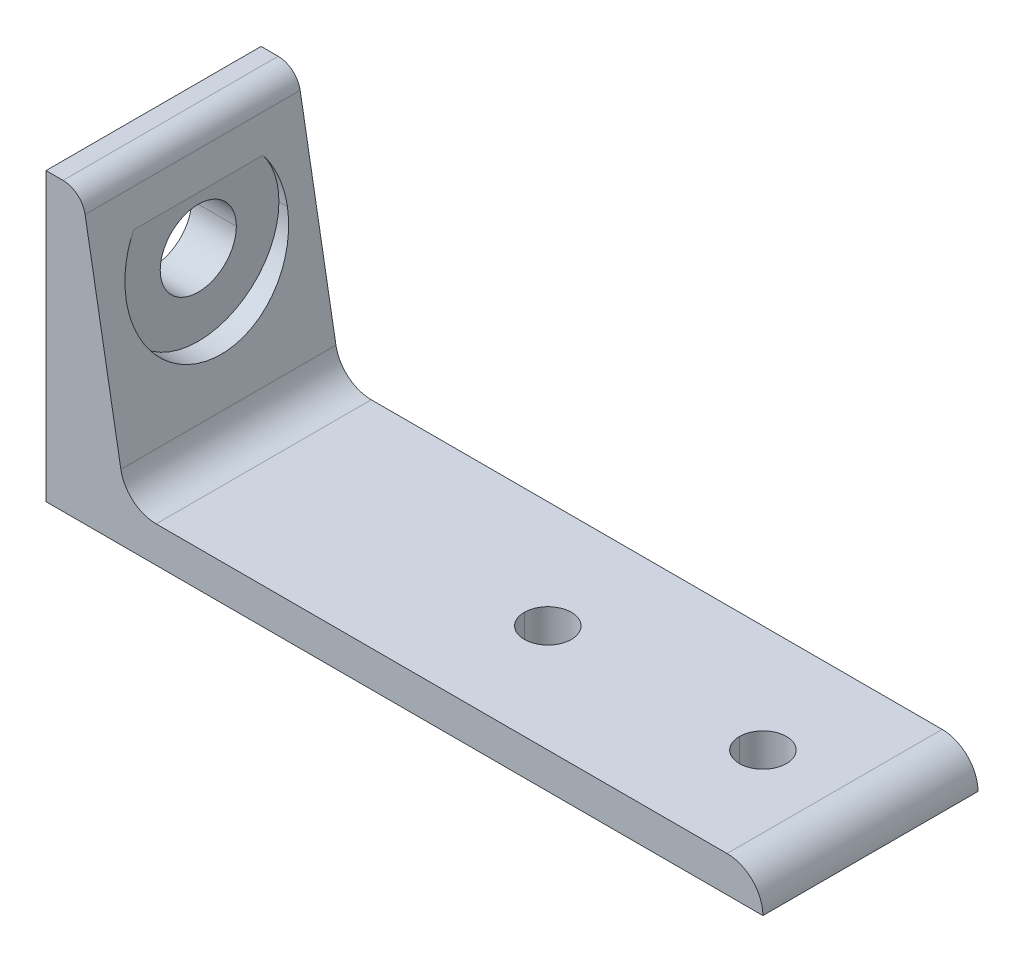
ISO-10303-21;
HEADER;
FILE_DESCRIPTION(('STEP AP214'),'2;1');
FILE_NAME('part.step','',(''),(''),'','','');
FILE_SCHEMA(('AUTOMOTIVE_DESIGN { 1 0 10303 214 1 1 1 1 }'));
ENDSEC;
DATA;
#1=APPLICATION_CONTEXT('core data for automotive mechanical design processes');
#2=APPLICATION_PROTOCOL_DEFINITION('international standard','automotive_design',2000,#1);
#3=PRODUCT_CONTEXT('',#1,'mechanical');
#4=PRODUCT('Part','Part','',(#3));
#5=PRODUCT_RELATED_PRODUCT_CATEGORY('part','',(#4));
#6=PRODUCT_DEFINITION_FORMATION('','',#4);
#7=PRODUCT_DEFINITION_CONTEXT('part definition',#1,'design');
#8=PRODUCT_DEFINITION('design','',#6,#7);
#9=PRODUCT_DEFINITION_SHAPE('','',#8);
#10=(LENGTH_UNIT() NAMED_UNIT(*) SI_UNIT(.MILLI.,.METRE.));
#11=(NAMED_UNIT(*) PLANE_ANGLE_UNIT() SI_UNIT($,.RADIAN.));
#12=(NAMED_UNIT(*) SI_UNIT($,.STERADIAN.) SOLID_ANGLE_UNIT());
#13=UNCERTAINTY_MEASURE_WITH_UNIT(LENGTH_MEASURE(1.E-05),#10,'distance_accuracy_value','');
#14=(GEOMETRIC_REPRESENTATION_CONTEXT(3) GLOBAL_UNCERTAINTY_ASSIGNED_CONTEXT((#13)) GLOBAL_UNIT_ASSIGNED_CONTEXT((#10,
#11,#12)) REPRESENTATION_CONTEXT('',''));
#15=CARTESIAN_POINT('',(0.,0.,0.));
#16=DIRECTION('',(0.,0.,1.));
#17=DIRECTION('',(1.,0.,0.));
#18=AXIS2_PLACEMENT_3D('',#15,#16,#17);
#19=CARTESIAN_POINT('',(107.95,-30.48,0.));
#20=DIRECTION('',(0.,1.,0.));
#21=DIRECTION('',(-1.,0.,0.));
#22=AXIS2_PLACEMENT_3D('',#19,#20,#21);
#23=CYLINDRICAL_SURFACE('',#22,4.1656);
#24=DIRECTION('',(0.,1.,0.));
#25=VECTOR('',#24,1.);
#26=CARTESIAN_POINT('',(112.1156,-30.48,0.));
#27=LINE('',#26,#25);
#28=CARTESIAN_POINT('',(112.1156,0.,0.));
#29=VERTEX_POINT('',#28);
#30=CARTESIAN_POINT('',(112.1156,6.35,0.));
#31=VERTEX_POINT('',#30);
#32=EDGE_CURVE('E381',#29,#31,#27,.T.);
#33=ORIENTED_EDGE('',*,*,#32,.F.);
#34=CARTESIAN_POINT('',(107.95,0.,0.));
#35=DIRECTION('',(0.,1.,0.));
#36=DIRECTION('',(-1.,0.,0.));
#37=AXIS2_PLACEMENT_3D('',#34,#35,#36);
#38=CIRCLE('',#37,4.1656);
#39=CARTESIAN_POINT('',(103.7844,0.,0.));
#40=VERTEX_POINT('',#39);
#41=EDGE_CURVE('E277',#40,#29,#38,.T.);
#42=ORIENTED_EDGE('',*,*,#41,.F.);
#43=DIRECTION('',(0.,1.,0.));
#44=VECTOR('',#43,1.);
#45=CARTESIAN_POINT('',(103.7844,-30.48,0.));
#46=LINE('',#45,#44);
#47=CARTESIAN_POINT('',(103.7844,6.35,0.));
#48=VERTEX_POINT('',#47);
#49=EDGE_CURVE('E216',#40,#48,#46,.T.);
#50=ORIENTED_EDGE('',*,*,#49,.T.);
#51=CARTESIAN_POINT('',(107.95,6.35,0.));
#52=DIRECTION('',(0.,1.,0.));
#53=DIRECTION('',(-1.,0.,0.));
#54=AXIS2_PLACEMENT_3D('',#51,#52,#53);
#55=CIRCLE('',#54,4.1656);
#56=EDGE_CURVE('E313',#48,#31,#55,.T.);
#57=ORIENTED_EDGE('',*,*,#56,.T.);
#58=EDGE_LOOP('',(#33,#42,#50,#57));
#59=FACE_BOUND('',#58,.T.);
#60=ADVANCED_FACE('F18',(#59),#23,.F.);
#61=CARTESIAN_POINT('',(69.85,-30.48,0.));
#62=DIRECTION('',(0.,1.,0.));
#63=DIRECTION('',(-1.,0.,0.));
#64=AXIS2_PLACEMENT_3D('',#61,#62,#63);
#65=CYLINDRICAL_SURFACE('',#64,4.1656);
#66=DIRECTION('',(0.,1.,0.));
#67=VECTOR('',#66,1.);
#68=CARTESIAN_POINT('',(74.0156,-30.48,0.));
#69=LINE('',#68,#67);
#70=CARTESIAN_POINT('',(74.0156,0.,0.));
#71=VERTEX_POINT('',#70);
#72=CARTESIAN_POINT('',(74.0156,6.35,0.));
#73=VERTEX_POINT('',#72);
#74=EDGE_CURVE('E218',#71,#73,#69,.T.);
#75=ORIENTED_EDGE('',*,*,#74,.F.);
#76=CARTESIAN_POINT('',(69.85,0.,0.));
#77=DIRECTION('',(0.,1.,0.));
#78=DIRECTION('',(-1.,0.,0.));
#79=AXIS2_PLACEMENT_3D('',#76,#77,#78);
#80=CIRCLE('',#79,4.1656);
#81=CARTESIAN_POINT('',(65.6844,0.,0.));
#82=VERTEX_POINT('',#81);
#83=EDGE_CURVE('E286',#82,#71,#80,.T.);
#84=ORIENTED_EDGE('',*,*,#83,.F.);
#85=DIRECTION('',(0.,1.,0.));
#86=VECTOR('',#85,1.);
#87=CARTESIAN_POINT('',(65.6844,-30.48,0.));
#88=LINE('',#87,#86);
#89=CARTESIAN_POINT('',(65.6844,6.35,0.));
#90=VERTEX_POINT('',#89);
#91=EDGE_CURVE('E244',#82,#90,#88,.T.);
#92=ORIENTED_EDGE('',*,*,#91,.T.);
#93=CARTESIAN_POINT('',(69.85,6.35,0.));
#94=DIRECTION('',(0.,1.,0.));
#95=DIRECTION('',(-1.,0.,0.));
#96=AXIS2_PLACEMENT_3D('',#93,#94,#95);
#97=CIRCLE('',#96,4.1656);
#98=EDGE_CURVE('E316',#90,#73,#97,.T.);
#99=ORIENTED_EDGE('',*,*,#98,.T.);
#100=EDGE_LOOP('',(#75,#84,#92,#99));
#101=FACE_BOUND('',#100,.T.);
#102=ADVANCED_FACE('F851',(#101),#65,.F.);
#103=CARTESIAN_POINT('',(7.9248,33.3248,0.));
#104=DIRECTION('',(-1.,0.,0.));
#105=DIRECTION('',(0.,0.,1.));
#106=AXIS2_PLACEMENT_3D('',#103,#104,#105);
#107=PLANE('',#106);
#108=CARTESIAN_POINT('',(7.9248,33.3248,0.));
#109=DIRECTION('',(1.,0.,0.));
#110=DIRECTION('',(0.,0.,1.));
#111=AXIS2_PLACEMENT_3D('',#108,#109,#110);
#112=CIRCLE('',#111,6.7437);
#113=CARTESIAN_POINT('',(7.9248,33.3248,6.7437));
#114=VERTEX_POINT('',#113);
#115=CARTESIAN_POINT('',(7.9248,33.3248,-6.7437));
#116=VERTEX_POINT('',#115);
#117=EDGE_CURVE('E198',#114,#116,#112,.T.);
#118=ORIENTED_EDGE('',*,*,#117,.F.);
#119=CARTESIAN_POINT('',(7.9248,33.3248,0.));
#120=DIRECTION('',(1.,0.,0.));
#121=DIRECTION('',(0.,0.,1.));
#122=AXIS2_PLACEMENT_3D('',#119,#120,#121);
#123=CIRCLE('',#122,6.7437);
#124=EDGE_CURVE('E26',#116,#114,#123,.T.);
#125=ORIENTED_EDGE('',*,*,#124,.F.);
#126=EDGE_LOOP('',(#118,#125));
#127=FACE_BOUND('',#126,.T.);
#128=CARTESIAN_POINT('',(7.9248,33.3248,0.));
#129=DIRECTION('',(-1.,0.,0.));
#130=DIRECTION('',(0.,0.,1.));
#131=AXIS2_PLACEMENT_3D('',#128,#129,#130);
#132=CIRCLE('',#131,14.2875);
#133=CARTESIAN_POINT('',(7.9248,41.8688653904658,-11.4512707964419));
#134=VERTEX_POINT('',#133);
#135=CARTESIAN_POINT('',(7.9248,33.3248,-14.2875));
#136=VERTEX_POINT('',#135);
#137=EDGE_CURVE('E11',#134,#136,#132,.T.);
#138=ORIENTED_EDGE('',*,*,#137,.F.);
#139=DIRECTION('',(0.,0.,-1.));
#140=VECTOR('',#139,1.);
#141=CARTESIAN_POINT('',(7.9248,41.8688653904658,19.05));
#142=LINE('',#141,#140);
#143=CARTESIAN_POINT('',(7.9248,41.8688653904658,11.4512707964419));
#144=VERTEX_POINT('',#143);
#145=EDGE_CURVE('E178',#144,#134,#142,.T.);
#146=ORIENTED_EDGE('',*,*,#145,.F.);
#147=CARTESIAN_POINT('',(7.9248,33.3248,0.));
#148=DIRECTION('',(-1.,0.,0.));
#149=DIRECTION('',(0.,0.,1.));
#150=AXIS2_PLACEMENT_3D('',#147,#148,#149);
#151=CIRCLE('',#150,14.2875);
#152=CARTESIAN_POINT('',(7.9248,33.3248,14.2875));
#153=VERTEX_POINT('',#152);
#154=EDGE_CURVE('E182',#153,#144,#151,.T.);
#155=ORIENTED_EDGE('',*,*,#154,.F.);
#156=CARTESIAN_POINT('',(7.9248,33.3248,0.));
#157=DIRECTION('',(-1.,0.,0.));
#158=DIRECTION('',(0.,0.,1.));
#159=AXIS2_PLACEMENT_3D('',#156,#157,#158);
#160=CIRCLE('',#159,14.2875);
#161=EDGE_CURVE('E210',#136,#153,#160,.T.);
#162=ORIENTED_EDGE('',*,*,#161,.F.);
#163=EDGE_LOOP('',(#138,#146,#155,#162));
#164=FACE_BOUND('',#163,.T.);
#165=ADVANCED_FACE('F180',(#127,#164),#107,.F.);
#166=CARTESIAN_POINT('',(44.7548,33.3248,0.));
#167=DIRECTION('',(-1.,0.,0.));
#168=DIRECTION('',(0.,0.,1.));
#169=AXIS2_PLACEMENT_3D('',#166,#167,#168);
#170=CYLINDRICAL_SURFACE('',#169,14.2875);
#171=DIRECTION('',(-1.,0.,0.));
#172=VECTOR('',#171,1.);
#173=CARTESIAN_POINT('',(44.7548,33.3248,-14.2875));
#174=LINE('',#173,#172);
#175=CARTESIAN_POINT('',(9.43134925327651,33.3248,-14.2875));
#176=VERTEX_POINT('',#175);
#177=EDGE_CURVE('E250',#176,#136,#174,.T.);
#178=ORIENTED_EDGE('',*,*,#177,.F.);
#179=CARTESIAN_POINT('',(7.9248,41.8688653904658,-11.4512707964419));
#180=CARTESIAN_POINT('',(8.36379439188637,39.3792044768465,-13.3088659947548));
#181=CARTESIAN_POINT('',(8.88362555644232,36.4310954440296,-14.2875));
#182=CARTESIAN_POINT('',(9.43134925327651,33.3248,-14.2875));
#183=(BOUNDED_CURVE() B_SPLINE_CURVE(3,(#179,#180,#181,#182),.UNSPECIFIED.,.F.,
.F.) B_SPLINE_CURVE_WITH_KNOTS((4,4),(0.929780621469788,1.5707963267949),
.UNSPECIFIED.) CURVE() GEOMETRIC_REPRESENTATION_ITEM() RATIONAL_B_SPLINE_CURVE((1.,
0.966050361475496,0.966050361475496,1.)) REPRESENTATION_ITEM(''));
#184=EDGE_CURVE('E188',#134,#176,#183,.T.);
#185=ORIENTED_EDGE('',*,*,#184,.F.);
#186=ORIENTED_EDGE('',*,*,#137,.T.);
#187=EDGE_LOOP('',(#178,#185,#186));
#188=FACE_BOUND('',#187,.T.);
#189=ADVANCED_FACE('F831',(#188),#170,.F.);
#190=CARTESIAN_POINT('',(36.83,33.3248,0.));
#191=DIRECTION('',(-1.,0.,0.));
#192=DIRECTION('',(0.,0.,1.));
#193=AXIS2_PLACEMENT_3D('',#190,#191,#192);
#194=CYLINDRICAL_SURFACE('',#193,6.7437);
#195=DIRECTION('',(-1.,0.,0.));
#196=VECTOR('',#195,1.);
#197=CARTESIAN_POINT('',(36.83,33.3248,-6.7437));
#198=LINE('',#197,#196);
#199=CARTESIAN_POINT('',(0.,33.3248,-6.7437));
#200=VERTEX_POINT('',#199);
#201=EDGE_CURVE('E236',#116,#200,#198,.T.);
#202=ORIENTED_EDGE('',*,*,#201,.F.);
#203=ORIENTED_EDGE('',*,*,#124,.T.);
#204=DIRECTION('',(-1.,0.,0.));
#205=VECTOR('',#204,1.);
#206=CARTESIAN_POINT('',(36.83,33.3248,6.7437));
#207=LINE('',#206,#205);
#208=CARTESIAN_POINT('',(0.,33.3248,6.7437));
#209=VERTEX_POINT('',#208);
#210=EDGE_CURVE('E260',#114,#209,#207,.T.);
#211=ORIENTED_EDGE('',*,*,#210,.T.);
#212=CARTESIAN_POINT('',(0.,33.3248,0.));
#213=DIRECTION('',(-1.,0.,0.));
#214=DIRECTION('',(0.,0.,1.));
#215=AXIS2_PLACEMENT_3D('',#212,#213,#214);
#216=CIRCLE('',#215,6.7437);
#217=EDGE_CURVE('E357',#209,#200,#216,.T.);
#218=ORIENTED_EDGE('',*,*,#217,.T.);
#219=EDGE_LOOP('',(#202,#203,#211,#218));
#220=FACE_BOUND('',#219,.T.);
#221=ADVANCED_FACE('F364',(#220),#194,.F.);
#222=CARTESIAN_POINT('',(3.02515162142313,46.8376,-19.05));
#223=DIRECTION('',(0.,0.,-1.));
#224=DIRECTION('',(0.,-1.,0.));
#225=AXIS2_PLACEMENT_3D('',#222,#223,#224);
#226=PLANE('',#225);
#227=DIRECTION('',(1.,0.,0.));
#228=VECTOR('',#227,1.);
#229=CARTESIAN_POINT('',(127.,0.,-19.05));
#230=LINE('',#229,#228);
#231=CARTESIAN_POINT('',(0.,0.,-19.05));
#232=VERTEX_POINT('',#231);
#233=CARTESIAN_POINT('',(127.,0.,-19.05));
#234=VERTEX_POINT('',#233);
#235=EDGE_CURVE('E264',#232,#234,#230,.T.);
#236=ORIENTED_EDGE('',*,*,#235,.F.);
#237=DIRECTION('',(0.,-1.,0.));
#238=VECTOR('',#237,1.);
#239=CARTESIAN_POINT('',(0.,0.,-19.05));
#240=LINE('',#239,#238);
#241=CARTESIAN_POINT('',(0.,50.8,-19.05));
#242=VERTEX_POINT('',#241);
#243=EDGE_CURVE('E50',#242,#232,#240,.T.);
#244=ORIENTED_EDGE('',*,*,#243,.F.);
#245=DIRECTION('',(-1.,0.,0.));
#246=VECTOR('',#245,1.);
#247=CARTESIAN_POINT('',(3.02515162142313,50.8,-19.05));
#248=LINE('',#247,#246);
#249=CARTESIAN_POINT('',(3.02515162142313,50.8,-19.05));
#250=VERTEX_POINT('',#249);
#251=EDGE_CURVE('E349',#250,#242,#248,.T.);
#252=ORIENTED_EDGE('',*,*,#251,.F.);
#253=CARTESIAN_POINT('',(3.02515162142313,46.8376,-19.05));
#254=DIRECTION('',(0.,0.,1.));
#255=DIRECTION('',(-1.,0.,0.));
#256=AXIS2_PLACEMENT_3D('',#253,#254,#255);
#257=CIRCLE('',#256,3.9624);
#258=CARTESIAN_POINT('',(6.92735386195871,47.5256635391874,-19.05));
#259=VERTEX_POINT('',#258);
#260=EDGE_CURVE('E309',#259,#250,#257,.T.);
#261=ORIENTED_EDGE('',*,*,#260,.F.);
#262=DIRECTION('',(-0.173648177666927,0.984807753012209,0.));
#263=VECTOR('',#262,1.);
#264=CARTESIAN_POINT('',(6.92735386195871,47.5256635391874,-19.05));
#265=LINE('',#264,#263);
#266=CARTESIAN_POINT('',(13.2624877188393,11.597334071815,-19.05));
#267=VERTEX_POINT('',#266);
#268=EDGE_CURVE('E251',#267,#259,#265,.T.);
#269=ORIENTED_EDGE('',*,*,#268,.F.);
#270=CARTESIAN_POINT('',(19.5160169504668,12.7,-19.05));
#271=DIRECTION('',(0.,0.,-1.));
#272=DIRECTION('',(1.,0.,0.));
#273=AXIS2_PLACEMENT_3D('',#270,#271,#272);
#274=CIRCLE('',#273,6.35);
#275=CARTESIAN_POINT('',(19.5160169504669,6.35,-19.05));
#276=VERTEX_POINT('',#275);
#277=EDGE_CURVE('E319',#276,#267,#274,.T.);
#278=ORIENTED_EDGE('',*,*,#277,.F.);
#279=DIRECTION('',(-1.,0.,0.));
#280=VECTOR('',#279,1.);
#281=CARTESIAN_POINT('',(19.5160169504669,6.35,-19.05));
#282=LINE('',#281,#280);
#283=CARTESIAN_POINT('',(120.65,6.35,-19.05));
#284=VERTEX_POINT('',#283);
#285=EDGE_CURVE('E235',#284,#276,#282,.T.);
#286=ORIENTED_EDGE('',*,*,#285,.F.);
#287=CARTESIAN_POINT('',(120.65,0.,-19.05));
#288=DIRECTION('',(0.,0.,1.));
#289=DIRECTION('',(-1.,0.,0.));
#290=AXIS2_PLACEMENT_3D('',#287,#288,#289);
#291=CIRCLE('',#290,6.35);
#292=EDGE_CURVE('E289',#234,#284,#291,.T.);
#293=ORIENTED_EDGE('',*,*,#292,.F.);
#294=EDGE_LOOP('',(#236,#244,#252,#261,#269,#278,#286,#293));
#295=FACE_BOUND('',#294,.T.);
#296=ADVANCED_FACE('F791',(#295),#226,.T.);
#297=CARTESIAN_POINT('',(3.02515162142313,46.8376,19.05));
#298=DIRECTION('',(0.,0.,-1.));
#299=DIRECTION('',(0.,-1.,0.));
#300=AXIS2_PLACEMENT_3D('',#297,#298,#299);
#301=PLANE('',#300);
#302=DIRECTION('',(1.,0.,0.));
#303=VECTOR('',#302,1.);
#304=CARTESIAN_POINT('',(127.,0.,19.05));
#305=LINE('',#304,#303);
#306=CARTESIAN_POINT('',(0.,0.,19.05));
#307=VERTEX_POINT('',#306);
#308=CARTESIAN_POINT('',(127.,0.,19.05));
#309=VERTEX_POINT('',#308);
#310=EDGE_CURVE('E269',#307,#309,#305,.T.);
#311=ORIENTED_EDGE('',*,*,#310,.T.);
#312=CARTESIAN_POINT('',(120.65,0.,19.05));
#313=DIRECTION('',(0.,0.,1.));
#314=DIRECTION('',(-1.,0.,0.));
#315=AXIS2_PLACEMENT_3D('',#312,#313,#314);
#316=CIRCLE('',#315,6.35);
#317=CARTESIAN_POINT('',(120.65,6.35,19.05));
#318=VERTEX_POINT('',#317);
#319=EDGE_CURVE('E297',#309,#318,#316,.T.);
#320=ORIENTED_EDGE('',*,*,#319,.T.);
#321=DIRECTION('',(-1.,0.,0.));
#322=VECTOR('',#321,1.);
#323=CARTESIAN_POINT('',(19.5160169504669,6.35,19.05));
#324=LINE('',#323,#322);
#325=CARTESIAN_POINT('',(19.5160169504669,6.35,19.05));
#326=VERTEX_POINT('',#325);
#327=EDGE_CURVE('E234',#318,#326,#324,.T.);
#328=ORIENTED_EDGE('',*,*,#327,.T.);
#329=CARTESIAN_POINT('',(19.5160169504668,12.7,19.05));
#330=DIRECTION('',(0.,0.,-1.));
#331=DIRECTION('',(1.,0.,0.));
#332=AXIS2_PLACEMENT_3D('',#329,#330,#331);
#333=CIRCLE('',#332,6.35);
#334=CARTESIAN_POINT('',(13.2624877188393,11.597334071815,19.05));
#335=VERTEX_POINT('',#334);
#336=EDGE_CURVE('E255',#326,#335,#333,.T.);
#337=ORIENTED_EDGE('',*,*,#336,.T.);
#338=DIRECTION('',(-0.173648177666927,0.984807753012209,0.));
#339=VECTOR('',#338,1.);
#340=CARTESIAN_POINT('',(6.92735386195871,47.5256635391874,19.05));
#341=LINE('',#340,#339);
#342=CARTESIAN_POINT('',(6.92735386195871,47.5256635391874,19.05));
#343=VERTEX_POINT('',#342);
#344=EDGE_CURVE('E189',#335,#343,#341,.T.);
#345=ORIENTED_EDGE('',*,*,#344,.T.);
#346=CARTESIAN_POINT('',(3.02515162142313,46.8376,19.05));
#347=DIRECTION('',(0.,0.,1.));
#348=DIRECTION('',(-1.,0.,0.));
#349=AXIS2_PLACEMENT_3D('',#346,#347,#348);
#350=CIRCLE('',#349,3.9624);
#351=CARTESIAN_POINT('',(3.02515162142313,50.8,19.05));
#352=VERTEX_POINT('',#351);
#353=EDGE_CURVE('E308',#343,#352,#350,.T.);
#354=ORIENTED_EDGE('',*,*,#353,.T.);
#355=DIRECTION('',(-1.,0.,0.));
#356=VECTOR('',#355,1.);
#357=CARTESIAN_POINT('',(3.02515162142313,50.8,19.05));
#358=LINE('',#357,#356);
#359=CARTESIAN_POINT('',(0.,50.8,19.05));
#360=VERTEX_POINT('',#359);
#361=EDGE_CURVE('E280',#352,#360,#358,.T.);
#362=ORIENTED_EDGE('',*,*,#361,.T.);
#363=DIRECTION('',(0.,-1.,0.));
#364=VECTOR('',#363,1.);
#365=CARTESIAN_POINT('',(0.,0.,19.05));
#366=LINE('',#365,#364);
#367=EDGE_CURVE('E39',#360,#307,#366,.T.);
#368=ORIENTED_EDGE('',*,*,#367,.T.);
#369=EDGE_LOOP('',(#311,#320,#328,#337,#345,#354,#362,#368));
#370=FACE_BOUND('',#369,.T.);
#371=ADVANCED_FACE('F786',(#370),#301,.F.);
#372=CARTESIAN_POINT('',(0.,0.,19.05));
#373=DIRECTION('',(1.,0.,0.));
#374=DIRECTION('',(0.,1.,0.));
#375=AXIS2_PLACEMENT_3D('',#372,#373,#374);
#376=PLANE('',#375);
#377=ORIENTED_EDGE('',*,*,#217,.F.);
#378=CARTESIAN_POINT('',(0.,33.3248,0.));
#379=DIRECTION('',(-1.,0.,0.));
#380=DIRECTION('',(0.,0.,1.));
#381=AXIS2_PLACEMENT_3D('',#378,#379,#380);
#382=CIRCLE('',#381,6.7437);
#383=EDGE_CURVE('E240',#200,#209,#382,.T.);
#384=ORIENTED_EDGE('',*,*,#383,.F.);
#385=EDGE_LOOP('',(#377,#384));
#386=FACE_BOUND('',#385,.T.);
#387=ORIENTED_EDGE('',*,*,#243,.T.);
#388=DIRECTION('',(0.,0.,-1.));
#389=VECTOR('',#388,1.);
#390=CARTESIAN_POINT('',(0.,0.,19.05));
#391=LINE('',#390,#389);
#392=EDGE_CURVE('E273',#307,#232,#391,.T.);
#393=ORIENTED_EDGE('',*,*,#392,.F.);
#394=ORIENTED_EDGE('',*,*,#367,.F.);
#395=DIRECTION('',(0.,0.,-1.));
#396=VECTOR('',#395,1.);
#397=CARTESIAN_POINT('',(0.,50.8,19.05));
#398=LINE('',#397,#396);
#399=EDGE_CURVE('E283',#360,#242,#398,.T.);
#400=ORIENTED_EDGE('',*,*,#399,.T.);
#401=EDGE_LOOP('',(#387,#393,#394,#400));
#402=FACE_BOUND('',#401,.T.);
#403=ADVANCED_FACE('F790',(#386,#402),#376,.F.);
#404=CARTESIAN_POINT('',(3.02515162142313,50.8,19.05));
#405=DIRECTION('',(0.,-1.,0.));
#406=DIRECTION('',(0.,0.,-1.));
#407=AXIS2_PLACEMENT_3D('',#404,#405,#406);
#408=PLANE('',#407);
#409=ORIENTED_EDGE('',*,*,#251,.T.);
#410=ORIENTED_EDGE('',*,*,#399,.F.);
#411=ORIENTED_EDGE('',*,*,#361,.F.);
#412=DIRECTION('',(0.,0.,-1.));
#413=VECTOR('',#412,1.);
#414=CARTESIAN_POINT('',(3.02515162142313,50.8,19.05));
#415=LINE('',#414,#413);
#416=EDGE_CURVE('E304',#352,#250,#415,.T.);
#417=ORIENTED_EDGE('',*,*,#416,.T.);
#418=EDGE_LOOP('',(#409,#410,#411,#417));
#419=FACE_BOUND('',#418,.T.);
#420=ADVANCED_FACE('F778',(#419),#408,.F.);
#421=CARTESIAN_POINT('',(3.02515162142313,46.8376,19.05));
#422=DIRECTION('',(0.,0.,-1.));
#423=DIRECTION('',(-1.,0.,0.));
#424=AXIS2_PLACEMENT_3D('',#421,#422,#423);
#425=CYLINDRICAL_SURFACE('',#424,3.9624);
#426=ORIENTED_EDGE('',*,*,#260,.T.);
#427=ORIENTED_EDGE('',*,*,#416,.F.);
#428=ORIENTED_EDGE('',*,*,#353,.F.);
#429=DIRECTION('',(0.,0.,-1.));
#430=VECTOR('',#429,1.);
#431=CARTESIAN_POINT('',(6.92735386195871,47.5256635391874,19.05));
#432=LINE('',#431,#430);
#433=EDGE_CURVE('E254',#343,#259,#432,.T.);
#434=ORIENTED_EDGE('',*,*,#433,.T.);
#435=EDGE_LOOP('',(#426,#427,#428,#434));
#436=FACE_BOUND('',#435,.T.);
#437=ADVANCED_FACE('F698',(#436),#425,.T.);
#438=CARTESIAN_POINT('',(6.92735386195871,47.5256635391874,19.05));
#439=DIRECTION('',(-0.984807753012209,-0.173648177666927,0.));
#440=DIRECTION('',(-0.173648177666927,0.984807753012209,0.));
#441=AXIS2_PLACEMENT_3D('',#438,#439,#440);
#442=PLANE('',#441);
#443=ORIENTED_EDGE('',*,*,#145,.T.);
#444=ORIENTED_EDGE('',*,*,#184,.T.);
#445=CARTESIAN_POINT('',(9.43134925327651,33.3248,-14.2875));
#446=CARTESIAN_POINT('',(14.4698927270208,4.74979999999999,-14.2875));
#447=CARTESIAN_POINT('',(14.4698927270208,4.74979999999999,14.2875));
#448=CARTESIAN_POINT('',(9.43134925327651,33.3248,14.2875));
#449=(BOUNDED_CURVE() B_SPLINE_CURVE(3,(#445,#446,#447,#448),.UNSPECIFIED.,.F.,
.F.) B_SPLINE_CURVE_WITH_KNOTS((4,4),(1.5707963267949,4.71238898038469),
.UNSPECIFIED.) CURVE() GEOMETRIC_REPRESENTATION_ITEM() RATIONAL_B_SPLINE_CURVE((1.,
0.333333333333334,0.333333333333334,1.)) REPRESENTATION_ITEM(''));
#450=CARTESIAN_POINT('',(9.43134925327651,33.3248,14.2875));
#451=VERTEX_POINT('',#450);
#452=EDGE_CURVE('E204',#176,#451,#449,.T.);
#453=ORIENTED_EDGE('',*,*,#452,.T.);
#454=CARTESIAN_POINT('',(9.43134925327651,33.3248,14.2875));
#455=CARTESIAN_POINT('',(8.88362555644232,36.4310954440296,14.2875));
#456=CARTESIAN_POINT('',(8.36379439188638,39.3792044768465,13.3088659947548));
#457=CARTESIAN_POINT('',(7.9248,41.8688653904658,11.4512707964419));
#458=(BOUNDED_CURVE() B_SPLINE_CURVE(3,(#454,#455,#456,#457),.UNSPECIFIED.,.F.,
.F.) B_SPLINE_CURVE_WITH_KNOTS((4,4),(4.71238898038469,5.3534046857098),
.UNSPECIFIED.) CURVE() GEOMETRIC_REPRESENTATION_ITEM() RATIONAL_B_SPLINE_CURVE((1.,
0.966050361475496,0.966050361475496,1.)) REPRESENTATION_ITEM(''));
#459=EDGE_CURVE('E193',#451,#144,#458,.T.);
#460=ORIENTED_EDGE('',*,*,#459,.T.);
#461=EDGE_LOOP('',(#443,#444,#453,#460));
#462=FACE_BOUND('',#461,.T.);
#463=ORIENTED_EDGE('',*,*,#268,.T.);
#464=ORIENTED_EDGE('',*,*,#433,.F.);
#465=ORIENTED_EDGE('',*,*,#344,.F.);
#466=DIRECTION('',(0.,0.,-1.));
#467=VECTOR('',#466,1.);
#468=CARTESIAN_POINT('',(13.2624877188393,11.597334071815,19.05));
#469=LINE('',#468,#467);
#470=EDGE_CURVE('E323',#335,#267,#469,.T.);
#471=ORIENTED_EDGE('',*,*,#470,.T.);
#472=EDGE_LOOP('',(#463,#464,#465,#471));
#473=FACE_BOUND('',#472,.T.);
#474=ADVANCED_FACE('F201',(#462,#473),#442,.F.);
#475=CARTESIAN_POINT('',(19.5160169504668,12.7,19.05));
#476=DIRECTION('',(0.,0.,-1.));
#477=DIRECTION('',(-1.,0.,0.));
#478=AXIS2_PLACEMENT_3D('',#475,#476,#477);
#479=CYLINDRICAL_SURFACE('',#478,6.35);
#480=ORIENTED_EDGE('',*,*,#277,.T.);
#481=ORIENTED_EDGE('',*,*,#470,.F.);
#482=ORIENTED_EDGE('',*,*,#336,.F.);
#483=DIRECTION('',(0.,0.,-1.));
#484=VECTOR('',#483,1.);
#485=CARTESIAN_POINT('',(19.5160169504669,6.35,19.05));
#486=LINE('',#485,#484);
#487=EDGE_CURVE('E230',#326,#276,#486,.T.);
#488=ORIENTED_EDGE('',*,*,#487,.T.);
#489=EDGE_LOOP('',(#480,#481,#482,#488));
#490=FACE_BOUND('',#489,.T.);
#491=ADVANCED_FACE('F697',(#490),#479,.F.);
#492=CARTESIAN_POINT('',(19.5160169504669,6.35,19.05));
#493=DIRECTION('',(0.,-1.,0.));
#494=DIRECTION('',(0.,0.,-1.));
#495=AXIS2_PLACEMENT_3D('',#492,#493,#494);
#496=PLANE('',#495);
#497=ORIENTED_EDGE('',*,*,#98,.F.);
#498=CARTESIAN_POINT('',(69.85,6.35,0.));
#499=DIRECTION('',(0.,1.,0.));
#500=DIRECTION('',(-1.,0.,0.));
#501=AXIS2_PLACEMENT_3D('',#498,#499,#500);
#502=CIRCLE('',#501,4.1656);
#503=EDGE_CURVE('E225',#73,#90,#502,.T.);
#504=ORIENTED_EDGE('',*,*,#503,.F.);
#505=EDGE_LOOP('',(#497,#504));
#506=FACE_BOUND('',#505,.T.);
#507=ORIENTED_EDGE('',*,*,#56,.F.);
#508=CARTESIAN_POINT('',(107.95,6.35,0.));
#509=DIRECTION('',(0.,1.,0.));
#510=DIRECTION('',(-1.,0.,0.));
#511=AXIS2_PLACEMENT_3D('',#508,#509,#510);
#512=CIRCLE('',#511,4.1656);
#513=EDGE_CURVE('E388',#31,#48,#512,.T.);
#514=ORIENTED_EDGE('',*,*,#513,.F.);
#515=EDGE_LOOP('',(#507,#514));
#516=FACE_BOUND('',#515,.T.);
#517=ORIENTED_EDGE('',*,*,#285,.T.);
#518=ORIENTED_EDGE('',*,*,#487,.F.);
#519=ORIENTED_EDGE('',*,*,#327,.F.);
#520=DIRECTION('',(0.,0.,-1.));
#521=VECTOR('',#520,1.);
#522=CARTESIAN_POINT('',(120.65,6.35,19.05));
#523=LINE('',#522,#521);
#524=EDGE_CURVE('E293',#318,#284,#523,.T.);
#525=ORIENTED_EDGE('',*,*,#524,.T.);
#526=EDGE_LOOP('',(#517,#518,#519,#525));
#527=FACE_BOUND('',#526,.T.);
#528=ADVANCED_FACE('F726',(#506,#516,#527),#496,.F.);
#529=CARTESIAN_POINT('',(120.65,0.,19.05));
#530=DIRECTION('',(0.,0.,-1.));
#531=DIRECTION('',(-1.,0.,0.));
#532=AXIS2_PLACEMENT_3D('',#529,#530,#531);
#533=CYLINDRICAL_SURFACE('',#532,6.35);
#534=ORIENTED_EDGE('',*,*,#292,.T.);
#535=ORIENTED_EDGE('',*,*,#524,.F.);
#536=ORIENTED_EDGE('',*,*,#319,.F.);
#537=DIRECTION('',(0.,0.,-1.));
#538=VECTOR('',#537,1.);
#539=CARTESIAN_POINT('',(127.,0.,19.05));
#540=LINE('',#539,#538);
#541=EDGE_CURVE('E265',#309,#234,#540,.T.);
#542=ORIENTED_EDGE('',*,*,#541,.T.);
#543=EDGE_LOOP('',(#534,#535,#536,#542));
#544=FACE_BOUND('',#543,.T.);
#545=ADVANCED_FACE('F708',(#544),#533,.T.);
#546=CARTESIAN_POINT('',(127.,0.,19.05));
#547=DIRECTION('',(0.,1.,0.));
#548=DIRECTION('',(1.,0.,0.));
#549=AXIS2_PLACEMENT_3D('',#546,#547,#548);
#550=PLANE('',#549);
#551=ORIENTED_EDGE('',*,*,#83,.T.);
#552=CARTESIAN_POINT('',(69.85,0.,0.));
#553=DIRECTION('',(0.,1.,0.));
#554=DIRECTION('',(-1.,0.,0.));
#555=AXIS2_PLACEMENT_3D('',#552,#553,#554);
#556=CIRCLE('',#555,4.1656);
#557=EDGE_CURVE('E226',#71,#82,#556,.T.);
#558=ORIENTED_EDGE('',*,*,#557,.T.);
#559=EDGE_LOOP('',(#551,#558));
#560=FACE_BOUND('',#559,.T.);
#561=ORIENTED_EDGE('',*,*,#41,.T.);
#562=CARTESIAN_POINT('',(107.95,0.,0.));
#563=DIRECTION('',(0.,1.,0.));
#564=DIRECTION('',(-1.,0.,0.));
#565=AXIS2_PLACEMENT_3D('',#562,#563,#564);
#566=CIRCLE('',#565,4.1656);
#567=EDGE_CURVE('E389',#29,#40,#566,.T.);
#568=ORIENTED_EDGE('',*,*,#567,.T.);
#569=EDGE_LOOP('',(#561,#568));
#570=FACE_BOUND('',#569,.T.);
#571=ORIENTED_EDGE('',*,*,#235,.T.);
#572=ORIENTED_EDGE('',*,*,#541,.F.);
#573=ORIENTED_EDGE('',*,*,#310,.F.);
#574=ORIENTED_EDGE('',*,*,#392,.T.);
#575=EDGE_LOOP('',(#571,#572,#573,#574));
#576=FACE_BOUND('',#575,.T.);
#577=ADVANCED_FACE('F407',(#560,#570,#576),#550,.F.);
#578=CARTESIAN_POINT('',(36.83,33.3248,0.));
#579=DIRECTION('',(-1.,0.,0.));
#580=DIRECTION('',(0.,0.,1.));
#581=AXIS2_PLACEMENT_3D('',#578,#579,#580);
#582=CYLINDRICAL_SURFACE('',#581,6.7437);
#583=ORIENTED_EDGE('',*,*,#117,.T.);
#584=ORIENTED_EDGE('',*,*,#201,.T.);
#585=ORIENTED_EDGE('',*,*,#383,.T.);
#586=ORIENTED_EDGE('',*,*,#210,.F.);
#587=EDGE_LOOP('',(#583,#584,#585,#586));
#588=FACE_BOUND('',#587,.T.);
#589=ADVANCED_FACE('F369',(#588),#582,.F.);
#590=CARTESIAN_POINT('',(44.7548,33.3248,0.));
#591=DIRECTION('',(-1.,0.,0.));
#592=DIRECTION('',(0.,0.,1.));
#593=AXIS2_PLACEMENT_3D('',#590,#591,#592);
#594=CYLINDRICAL_SURFACE('',#593,14.2875);
#595=ORIENTED_EDGE('',*,*,#459,.F.);
#596=DIRECTION('',(-1.,0.,0.));
#597=VECTOR('',#596,1.);
#598=CARTESIAN_POINT('',(44.7548,33.3248,14.2875));
#599=LINE('',#598,#597);
#600=EDGE_CURVE('E195',#451,#153,#599,.T.);
#601=ORIENTED_EDGE('',*,*,#600,.T.);
#602=ORIENTED_EDGE('',*,*,#154,.T.);
#603=EDGE_LOOP('',(#595,#601,#602));
#604=FACE_BOUND('',#603,.T.);
#605=ADVANCED_FACE('F192',(#604),#594,.F.);
#606=CARTESIAN_POINT('',(44.7548,33.3248,0.));
#607=DIRECTION('',(-1.,0.,0.));
#608=DIRECTION('',(0.,0.,1.));
#609=AXIS2_PLACEMENT_3D('',#606,#607,#608);
#610=CYLINDRICAL_SURFACE('',#609,14.2875);
#611=ORIENTED_EDGE('',*,*,#452,.F.);
#612=ORIENTED_EDGE('',*,*,#177,.T.);
#613=ORIENTED_EDGE('',*,*,#161,.T.);
#614=ORIENTED_EDGE('',*,*,#600,.F.);
#615=EDGE_LOOP('',(#611,#612,#613,#614));
#616=FACE_BOUND('',#615,.T.);
#617=ADVANCED_FACE('F686',(#616),#610,.F.);
#618=CARTESIAN_POINT('',(69.85,-30.48,0.));
#619=DIRECTION('',(0.,1.,0.));
#620=DIRECTION('',(-1.,0.,0.));
#621=AXIS2_PLACEMENT_3D('',#618,#619,#620);
#622=CYLINDRICAL_SURFACE('',#621,4.1656);
#623=ORIENTED_EDGE('',*,*,#557,.F.);
#624=ORIENTED_EDGE('',*,*,#74,.T.);
#625=ORIENTED_EDGE('',*,*,#503,.T.);
#626=ORIENTED_EDGE('',*,*,#91,.F.);
#627=EDGE_LOOP('',(#623,#624,#625,#626));
#628=FACE_BOUND('',#627,.T.);
#629=ADVANCED_FACE('F675',(#628),#622,.F.);
#630=CARTESIAN_POINT('',(107.95,-30.48,0.));
#631=DIRECTION('',(0.,1.,0.));
#632=DIRECTION('',(-1.,0.,0.));
#633=AXIS2_PLACEMENT_3D('',#630,#631,#632);
#634=CYLINDRICAL_SURFACE('',#633,4.1656);
#635=ORIENTED_EDGE('',*,*,#567,.F.);
#636=ORIENTED_EDGE('',*,*,#32,.T.);
#637=ORIENTED_EDGE('',*,*,#513,.T.);
#638=ORIENTED_EDGE('',*,*,#49,.F.);
#639=EDGE_LOOP('',(#635,#636,#637,#638));
#640=FACE_BOUND('',#639,.T.);
#641=ADVANCED_FACE('F405',(#640),#634,.F.);
#642=CLOSED_SHELL('',(#60,#102,#165,#189,#221,#296,#371,#403,#420,#437,#474,#491,#528,#545,#577,
#589,#605,#617,#629,#641));
#643=MANIFOLD_SOLID_BREP('B1',#642);
#644=ADVANCED_BREP_SHAPE_REPRESENTATION('',(#18,#643),#14);
#645=SHAPE_DEFINITION_REPRESENTATION(#9,#644);
ENDSEC;
END-ISO-10303-21;
